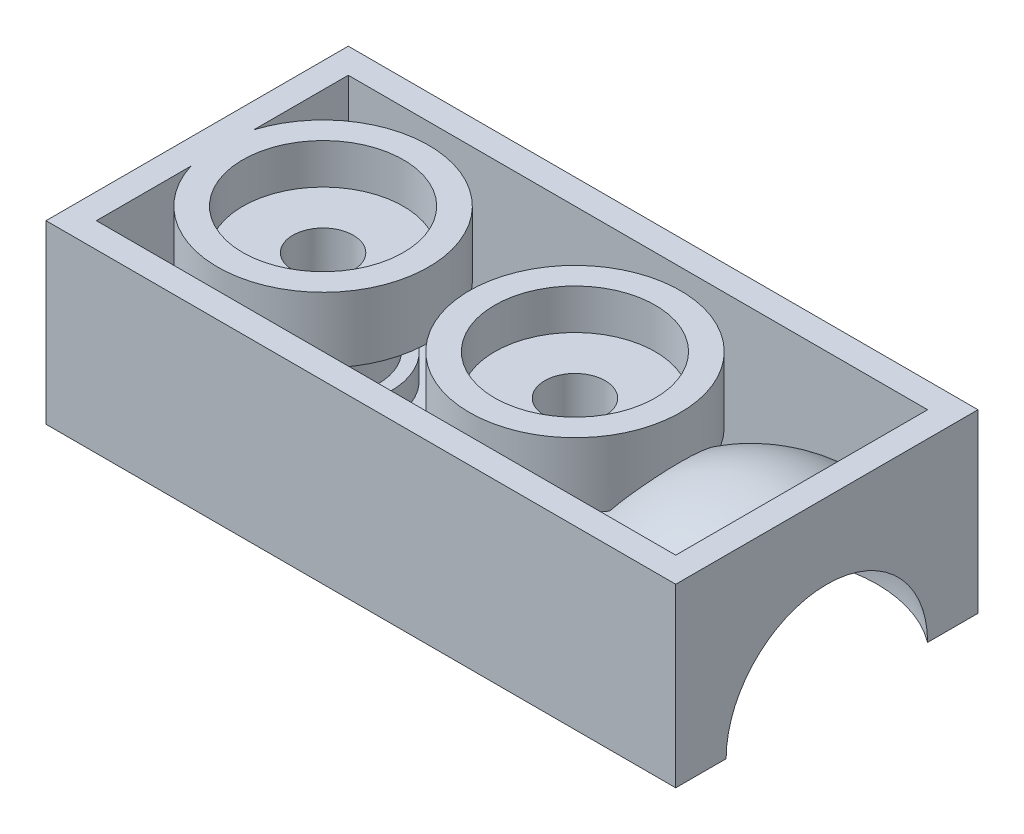
ISO-10303-21;
HEADER;
FILE_DESCRIPTION(('STEP AP214'),'2;1');
FILE_NAME('part.step','',(''),(''),'','','');
FILE_SCHEMA(('AUTOMOTIVE_DESIGN { 1 0 10303 214 1 1 1 1 }'));
ENDSEC;
DATA;
#1=APPLICATION_CONTEXT('core data for automotive mechanical design processes');
#2=APPLICATION_PROTOCOL_DEFINITION('international standard','automotive_design',2000,#1);
#3=PRODUCT_CONTEXT('',#1,'mechanical');
#4=PRODUCT('Part','Part','',(#3));
#5=PRODUCT_RELATED_PRODUCT_CATEGORY('part','',(#4));
#6=PRODUCT_DEFINITION_FORMATION('','',#4);
#7=PRODUCT_DEFINITION_CONTEXT('part definition',#1,'design');
#8=PRODUCT_DEFINITION('design','',#6,#7);
#9=PRODUCT_DEFINITION_SHAPE('','',#8);
#10=(LENGTH_UNIT() NAMED_UNIT(*) SI_UNIT(.MILLI.,.METRE.));
#11=(NAMED_UNIT(*) PLANE_ANGLE_UNIT() SI_UNIT($,.RADIAN.));
#12=(NAMED_UNIT(*) SI_UNIT($,.STERADIAN.) SOLID_ANGLE_UNIT());
#13=UNCERTAINTY_MEASURE_WITH_UNIT(LENGTH_MEASURE(1.E-05),#10,'distance_accuracy_value','');
#14=(GEOMETRIC_REPRESENTATION_CONTEXT(3) GLOBAL_UNCERTAINTY_ASSIGNED_CONTEXT((#13)) GLOBAL_UNIT_ASSIGNED_CONTEXT((#10,
#11,#12)) REPRESENTATION_CONTEXT('',''));
#15=CARTESIAN_POINT('',(0.,0.,0.));
#16=DIRECTION('',(0.,0.,1.));
#17=DIRECTION('',(1.,0.,0.));
#18=AXIS2_PLACEMENT_3D('',#15,#16,#17);
#19=CARTESIAN_POINT('',(0.,7.,0.));
#20=DIRECTION('',(0.,1.,0.));
#21=DIRECTION('',(0.,0.,1.));
#22=AXIS2_PLACEMENT_3D('',#19,#20,#21);
#23=PLANE('',#22);
#24=CARTESIAN_POINT('',(2.5,7.,0.));
#25=DIRECTION('',(0.,1.,0.));
#26=DIRECTION('',(0.,0.,1.));
#27=AXIS2_PLACEMENT_3D('',#24,#25,#26);
#28=CIRCLE('',#27,3.19);
#29=CARTESIAN_POINT('',(2.5,7.,3.19));
#30=VERTEX_POINT('',#29);
#31=EDGE_CURVE('E292',#30,#30,#28,.T.);
#32=ORIENTED_EDGE('',*,*,#31,.F.);
#33=EDGE_LOOP('',(#32));
#34=FACE_BOUND('',#33,.T.);
#35=CARTESIAN_POINT('',(2.5,7.,0.));
#36=DIRECTION('',(0.,1.,0.));
#37=DIRECTION('',(0.,0.,1.));
#38=AXIS2_PLACEMENT_3D('',#35,#36,#37);
#39=CIRCLE('',#38,4.19);
#40=CARTESIAN_POINT('',(2.5,7.,4.19));
#41=VERTEX_POINT('',#40);
#42=EDGE_CURVE('E180',#41,#41,#39,.T.);
#43=ORIENTED_EDGE('',*,*,#42,.T.);
#44=EDGE_LOOP('',(#43));
#45=FACE_BOUND('',#44,.T.);
#46=ADVANCED_FACE('F33',(#34,#45),#23,.T.);
#47=CARTESIAN_POINT('',(-7.5,7.,0.));
#48=DIRECTION('',(0.,1.,0.));
#49=DIRECTION('',(0.,0.,1.));
#50=AXIS2_PLACEMENT_3D('',#47,#48,#49);
#51=CYLINDRICAL_SURFACE('',#50,1.2);
#52=CARTESIAN_POINT('',(-7.5,5.4,0.));
#53=DIRECTION('',(0.,1.,0.));
#54=DIRECTION('',(0.,0.,1.));
#55=AXIS2_PLACEMENT_3D('',#52,#53,#54);
#56=CIRCLE('',#55,1.2);
#57=CARTESIAN_POINT('',(-7.5,5.4,1.2));
#58=VERTEX_POINT('',#57);
#59=EDGE_CURVE('E359',#58,#58,#56,.T.);
#60=ORIENTED_EDGE('',*,*,#59,.T.);
#61=EDGE_LOOP('',(#60));
#62=FACE_BOUND('',#61,.T.);
#63=CARTESIAN_POINT('',(-7.5,1.,0.));
#64=DIRECTION('',(0.,-1.,0.));
#65=DIRECTION('',(0.,0.,-1.));
#66=AXIS2_PLACEMENT_3D('',#63,#64,#65);
#67=CIRCLE('',#66,1.2);
#68=CARTESIAN_POINT('',(-7.5,1.,-1.2));
#69=VERTEX_POINT('',#68);
#70=EDGE_CURVE('E343',#69,#69,#67,.T.);
#71=ORIENTED_EDGE('',*,*,#70,.T.);
#72=EDGE_LOOP('',(#71));
#73=FACE_BOUND('',#72,.T.);
#74=ADVANCED_FACE('F247',(#62,#73),#51,.F.);
#75=CARTESIAN_POINT('',(-12.5,7.,-6.));
#76=DIRECTION('',(1.,0.,0.));
#77=DIRECTION('',(0.,0.,-1.));
#78=AXIS2_PLACEMENT_3D('',#75,#76,#77);
#79=PLANE('',#78);
#80=DIRECTION('',(0.,0.,1.));
#81=VECTOR('',#80,1.);
#82=CARTESIAN_POINT('',(-12.5,0.,-6.));
#83=LINE('',#82,#81);
#84=CARTESIAN_POINT('',(-12.5,0.,-6.));
#85=VERTEX_POINT('',#84);
#86=CARTESIAN_POINT('',(-12.5,0.,6.));
#87=VERTEX_POINT('',#86);
#88=EDGE_CURVE('E372',#85,#87,#83,.T.);
#89=ORIENTED_EDGE('',*,*,#88,.T.);
#90=DIRECTION('',(0.,-1.,0.));
#91=VECTOR('',#90,1.);
#92=CARTESIAN_POINT('',(-12.5,7.,6.));
#93=LINE('',#92,#91);
#94=CARTESIAN_POINT('',(-12.5,7.,6.));
#95=VERTEX_POINT('',#94);
#96=EDGE_CURVE('E41',#95,#87,#93,.T.);
#97=ORIENTED_EDGE('',*,*,#96,.F.);
#98=DIRECTION('',(0.,0.,1.));
#99=VECTOR('',#98,1.);
#100=CARTESIAN_POINT('',(-12.5,7.,-6.));
#101=LINE('',#100,#99);
#102=CARTESIAN_POINT('',(-12.5,7.,-6.));
#103=VERTEX_POINT('',#102);
#104=EDGE_CURVE('E373',#103,#95,#101,.T.);
#105=ORIENTED_EDGE('',*,*,#104,.F.);
#106=DIRECTION('',(0.,-1.,0.));
#107=VECTOR('',#106,1.);
#108=CARTESIAN_POINT('',(-12.5,7.,-6.));
#109=LINE('',#108,#107);
#110=EDGE_CURVE('E383',#103,#85,#109,.T.);
#111=ORIENTED_EDGE('',*,*,#110,.T.);
#112=EDGE_LOOP('',(#89,#97,#105,#111));
#113=FACE_BOUND('',#112,.T.);
#114=ADVANCED_FACE('F35',(#113),#79,.F.);
#115=CARTESIAN_POINT('',(-12.5,7.,6.));
#116=DIRECTION('',(0.,0.,-1.));
#117=DIRECTION('',(-1.,0.,0.));
#118=AXIS2_PLACEMENT_3D('',#115,#116,#117);
#119=PLANE('',#118);
#120=DIRECTION('',(1.,0.,0.));
#121=VECTOR('',#120,1.);
#122=CARTESIAN_POINT('',(-12.5,0.,6.));
#123=LINE('',#122,#121);
#124=CARTESIAN_POINT('',(12.5,0.,6.));
#125=VERTEX_POINT('',#124);
#126=EDGE_CURVE('E386',#87,#125,#123,.T.);
#127=ORIENTED_EDGE('',*,*,#126,.T.);
#128=DIRECTION('',(0.,-1.,0.));
#129=VECTOR('',#128,1.);
#130=CARTESIAN_POINT('',(12.5,7.,6.));
#131=LINE('',#130,#129);
#132=CARTESIAN_POINT('',(12.5,7.,6.));
#133=VERTEX_POINT('',#132);
#134=EDGE_CURVE('E398',#133,#125,#131,.T.);
#135=ORIENTED_EDGE('',*,*,#134,.F.);
#136=DIRECTION('',(1.,0.,0.));
#137=VECTOR('',#136,1.);
#138=CARTESIAN_POINT('',(-12.5,7.,6.));
#139=LINE('',#138,#137);
#140=EDGE_CURVE('E376',#95,#133,#139,.T.);
#141=ORIENTED_EDGE('',*,*,#140,.F.);
#142=ORIENTED_EDGE('',*,*,#96,.T.);
#143=EDGE_LOOP('',(#127,#135,#141,#142));
#144=FACE_BOUND('',#143,.T.);
#145=ADVANCED_FACE('F276',(#144),#119,.F.);
#146=CARTESIAN_POINT('',(12.5,7.,-6.));
#147=DIRECTION('',(-1.,0.,0.));
#148=DIRECTION('',(0.,0.,1.));
#149=AXIS2_PLACEMENT_3D('',#146,#147,#148);
#150=PLANE('',#149);
#151=CARTESIAN_POINT('',(12.5,0.,0.));
#152=DIRECTION('',(-1.,0.,0.));
#153=DIRECTION('',(0.,0.,1.));
#154=AXIS2_PLACEMENT_3D('',#151,#152,#153);
#155=CIRCLE('',#154,3.99924156033545);
#156=CARTESIAN_POINT('',(12.5,0.,-3.99924156033545));
#157=VERTEX_POINT('',#156);
#158=CARTESIAN_POINT('',(12.5,0.,3.99924156033545));
#159=VERTEX_POINT('',#158);
#160=EDGE_CURVE('E54',#157,#159,#155,.F.);
#161=ORIENTED_EDGE('',*,*,#160,.F.);
#162=DIRECTION('',(0.,0.,-1.));
#163=VECTOR('',#162,1.);
#164=CARTESIAN_POINT('',(12.5,0.,-6.));
#165=LINE('',#164,#163);
#166=CARTESIAN_POINT('',(12.5,0.,-6.));
#167=VERTEX_POINT('',#166);
#168=EDGE_CURVE('E388',#157,#167,#165,.T.);
#169=ORIENTED_EDGE('',*,*,#168,.T.);
#170=DIRECTION('',(0.,-1.,0.));
#171=VECTOR('',#170,1.);
#172=CARTESIAN_POINT('',(12.5,7.,-6.));
#173=LINE('',#172,#171);
#174=CARTESIAN_POINT('',(12.5,7.,-6.));
#175=VERTEX_POINT('',#174);
#176=EDGE_CURVE('E395',#175,#167,#173,.T.);
#177=ORIENTED_EDGE('',*,*,#176,.F.);
#178=DIRECTION('',(0.,0.,-1.));
#179=VECTOR('',#178,1.);
#180=CARTESIAN_POINT('',(12.5,7.,-6.));
#181=LINE('',#180,#179);
#182=EDGE_CURVE('E379',#133,#175,#181,.T.);
#183=ORIENTED_EDGE('',*,*,#182,.F.);
#184=ORIENTED_EDGE('',*,*,#134,.T.);
#185=EDGE_CURVE('E389',#125,#159,#165,.T.);
#186=ORIENTED_EDGE('',*,*,#185,.T.);
#187=EDGE_LOOP('',(#161,#169,#177,#183,#184,#186));
#188=FACE_BOUND('',#187,.T.);
#189=ADVANCED_FACE('F273',(#188),#150,.F.);
#190=CARTESIAN_POINT('',(-12.5,7.,-6.));
#191=DIRECTION('',(0.,0.,1.));
#192=DIRECTION('',(1.,0.,0.));
#193=AXIS2_PLACEMENT_3D('',#190,#191,#192);
#194=PLANE('',#193);
#195=DIRECTION('',(-1.,0.,0.));
#196=VECTOR('',#195,1.);
#197=CARTESIAN_POINT('',(-12.5,0.,-6.));
#198=LINE('',#197,#196);
#199=EDGE_CURVE('E377',#167,#85,#198,.T.);
#200=ORIENTED_EDGE('',*,*,#199,.T.);
#201=ORIENTED_EDGE('',*,*,#110,.F.);
#202=DIRECTION('',(-1.,0.,0.));
#203=VECTOR('',#202,1.);
#204=CARTESIAN_POINT('',(-12.5,7.,-6.));
#205=LINE('',#204,#203);
#206=EDGE_CURVE('E381',#175,#103,#205,.T.);
#207=ORIENTED_EDGE('',*,*,#206,.F.);
#208=ORIENTED_EDGE('',*,*,#176,.T.);
#209=EDGE_LOOP('',(#200,#201,#207,#208));
#210=FACE_BOUND('',#209,.T.);
#211=ADVANCED_FACE('F266',(#210),#194,.F.);
#212=DIRECTION('',(0.,0.,1.));
#213=VECTOR('',#212,1.);
#214=CARTESIAN_POINT('',(-11.5,7.,-6.));
#215=LINE('',#214,#213);
#216=CARTESIAN_POINT('',(-11.5,7.,-5.));
#217=VERTEX_POINT('',#216);
#218=CARTESIAN_POINT('',(-11.5,7.,-1.2474373731775));
#219=VERTEX_POINT('',#218);
#220=EDGE_CURVE('E186',#217,#219,#215,.T.);
#221=ORIENTED_EDGE('',*,*,#220,.F.);
#222=DIRECTION('',(-1.,0.,0.));
#223=VECTOR('',#222,1.);
#224=CARTESIAN_POINT('',(-12.5,7.,-5.));
#225=LINE('',#224,#223);
#226=CARTESIAN_POINT('',(11.5,7.,-5.));
#227=VERTEX_POINT('',#226);
#228=EDGE_CURVE('E168',#227,#217,#225,.T.);
#229=ORIENTED_EDGE('',*,*,#228,.F.);
#230=DIRECTION('',(0.,0.,-1.));
#231=VECTOR('',#230,1.);
#232=CARTESIAN_POINT('',(11.5,7.,-6.));
#233=LINE('',#232,#231);
#234=CARTESIAN_POINT('',(11.5,7.,5.));
#235=VERTEX_POINT('',#234);
#236=EDGE_CURVE('E48',#235,#227,#233,.T.);
#237=ORIENTED_EDGE('',*,*,#236,.F.);
#238=DIRECTION('',(1.,0.,0.));
#239=VECTOR('',#238,1.);
#240=CARTESIAN_POINT('',(-12.5,7.,5.));
#241=LINE('',#240,#239);
#242=CARTESIAN_POINT('',(-11.5,7.,5.));
#243=VERTEX_POINT('',#242);
#244=EDGE_CURVE('E189',#243,#235,#241,.T.);
#245=ORIENTED_EDGE('',*,*,#244,.F.);
#246=CARTESIAN_POINT('',(-11.5,7.,1.24743737317751));
#247=VERTEX_POINT('',#246);
#248=EDGE_CURVE('E148',#247,#243,#215,.T.);
#249=ORIENTED_EDGE('',*,*,#248,.F.);
#250=CARTESIAN_POINT('',(-7.5,7.,0.));
#251=DIRECTION('',(0.,1.,0.));
#252=DIRECTION('',(0.,0.,1.));
#253=AXIS2_PLACEMENT_3D('',#250,#251,#252);
#254=CIRCLE('',#253,4.19);
#255=EDGE_CURVE('E181',#247,#219,#254,.T.);
#256=ORIENTED_EDGE('',*,*,#255,.T.);
#257=EDGE_LOOP('',(#221,#229,#237,#245,#249,#256));
#258=FACE_BOUND('',#257,.T.);
#259=CARTESIAN_POINT('',(-7.5,7.,0.));
#260=DIRECTION('',(0.,1.,0.));
#261=DIRECTION('',(0.,0.,1.));
#262=AXIS2_PLACEMENT_3D('',#259,#260,#261);
#263=CIRCLE('',#262,3.19);
#264=CARTESIAN_POINT('',(-7.5,7.,3.19));
#265=VERTEX_POINT('',#264);
#266=EDGE_CURVE('E351',#265,#265,#263,.T.);
#267=ORIENTED_EDGE('',*,*,#266,.F.);
#268=EDGE_LOOP('',(#267));
#269=FACE_BOUND('',#268,.T.);
#270=ORIENTED_EDGE('',*,*,#104,.T.);
#271=ORIENTED_EDGE('',*,*,#140,.T.);
#272=ORIENTED_EDGE('',*,*,#182,.T.);
#273=ORIENTED_EDGE('',*,*,#206,.T.);
#274=EDGE_LOOP('',(#270,#271,#272,#273));
#275=FACE_BOUND('',#274,.T.);
#276=ADVANCED_FACE('F263',(#258,#269,#275),#23,.T.);
#277=CARTESIAN_POINT('',(0.,0.,0.));
#278=DIRECTION('',(0.,1.,0.));
#279=DIRECTION('',(0.,0.,1.));
#280=AXIS2_PLACEMENT_3D('',#277,#278,#279);
#281=PLANE('',#280);
#282=CARTESIAN_POINT('',(9.5,0.,0.));
#283=DIRECTION('',(0.,1.,0.));
#284=DIRECTION('',(0.,0.,1.));
#285=AXIS2_PLACEMENT_3D('',#282,#283,#284);
#286=CIRCLE('',#285,4.99939326897918);
#287=EDGE_CURVE('E11',#159,#157,#286,.F.);
#288=ORIENTED_EDGE('',*,*,#287,.F.);
#289=ORIENTED_EDGE('',*,*,#185,.F.);
#290=ORIENTED_EDGE('',*,*,#126,.F.);
#291=ORIENTED_EDGE('',*,*,#88,.F.);
#292=ORIENTED_EDGE('',*,*,#199,.F.);
#293=ORIENTED_EDGE('',*,*,#168,.F.);
#294=EDGE_LOOP('',(#288,#289,#290,#291,#292,#293));
#295=FACE_BOUND('',#294,.T.);
#296=CARTESIAN_POINT('',(-7.5,0.,0.));
#297=DIRECTION('',(0.,-1.,0.));
#298=DIRECTION('',(0.,0.,-1.));
#299=AXIS2_PLACEMENT_3D('',#296,#297,#298);
#300=CIRCLE('',#299,1.7);
#301=CARTESIAN_POINT('',(-7.5,0.,-1.7));
#302=VERTEX_POINT('',#301);
#303=EDGE_CURVE('E345',#302,#302,#300,.T.);
#304=ORIENTED_EDGE('',*,*,#303,.F.);
#305=EDGE_LOOP('',(#304));
#306=FACE_BOUND('',#305,.T.);
#307=CARTESIAN_POINT('',(2.5,0.,0.));
#308=DIRECTION('',(0.,1.,0.));
#309=DIRECTION('',(0.,0.,1.));
#310=AXIS2_PLACEMENT_3D('',#307,#308,#309);
#311=CIRCLE('',#310,1.2);
#312=CARTESIAN_POINT('',(2.5,0.,1.2));
#313=VERTEX_POINT('',#312);
#314=EDGE_CURVE('E369',#313,#313,#311,.T.);
#315=ORIENTED_EDGE('',*,*,#314,.T.);
#316=EDGE_LOOP('',(#315));
#317=FACE_BOUND('',#316,.T.);
#318=ADVANCED_FACE('F261',(#295,#306,#317),#281,.F.);
#319=CARTESIAN_POINT('',(2.5,7.,0.));
#320=DIRECTION('',(0.,1.,0.));
#321=DIRECTION('',(0.,0.,1.));
#322=AXIS2_PLACEMENT_3D('',#319,#320,#321);
#323=CYLINDRICAL_SURFACE('',#322,1.2);
#324=ORIENTED_EDGE('',*,*,#314,.F.);
#325=EDGE_LOOP('',(#324));
#326=FACE_BOUND('',#325,.T.);
#327=CARTESIAN_POINT('',(2.5,5.4,0.));
#328=DIRECTION('',(0.,1.,0.));
#329=DIRECTION('',(0.,0.,1.));
#330=AXIS2_PLACEMENT_3D('',#327,#328,#329);
#331=CIRCLE('',#330,1.2);
#332=CARTESIAN_POINT('',(2.5,5.4,1.2));
#333=VERTEX_POINT('',#332);
#334=EDGE_CURVE('E366',#333,#333,#331,.T.);
#335=ORIENTED_EDGE('',*,*,#334,.T.);
#336=EDGE_LOOP('',(#335));
#337=FACE_BOUND('',#336,.T.);
#338=ADVANCED_FACE('F257',(#326,#337),#323,.F.);
#339=CARTESIAN_POINT('',(3.7,5.4,0.));
#340=DIRECTION('',(0.,-1.,0.));
#341=DIRECTION('',(0.,0.,-1.));
#342=AXIS2_PLACEMENT_3D('',#339,#340,#341);
#343=PLANE('',#342);
#344=ORIENTED_EDGE('',*,*,#334,.F.);
#345=EDGE_LOOP('',(#344));
#346=FACE_BOUND('',#345,.T.);
#347=CARTESIAN_POINT('',(2.5,5.4,0.));
#348=DIRECTION('',(0.,1.,0.));
#349=DIRECTION('',(0.,0.,1.));
#350=AXIS2_PLACEMENT_3D('',#347,#348,#349);
#351=CIRCLE('',#350,3.19);
#352=CARTESIAN_POINT('',(2.5,5.4,3.19));
#353=VERTEX_POINT('',#352);
#354=EDGE_CURVE('E363',#353,#353,#351,.T.);
#355=ORIENTED_EDGE('',*,*,#354,.T.);
#356=EDGE_LOOP('',(#355));
#357=FACE_BOUND('',#356,.T.);
#358=ADVANCED_FACE('F253',(#346,#357),#343,.F.);
#359=CARTESIAN_POINT('',(2.5,7.,0.));
#360=DIRECTION('',(0.,1.,0.));
#361=DIRECTION('',(0.,0.,1.));
#362=AXIS2_PLACEMENT_3D('',#359,#360,#361);
#363=CYLINDRICAL_SURFACE('',#362,3.19);
#364=ORIENTED_EDGE('',*,*,#354,.F.);
#365=EDGE_LOOP('',(#364));
#366=FACE_BOUND('',#365,.T.);
#367=ORIENTED_EDGE('',*,*,#31,.T.);
#368=EDGE_LOOP('',(#367));
#369=FACE_BOUND('',#368,.T.);
#370=ADVANCED_FACE('F245',(#366,#369),#363,.F.);
#371=CARTESIAN_POINT('',(-6.3,5.4,0.));
#372=DIRECTION('',(0.,-1.,0.));
#373=DIRECTION('',(0.,0.,-1.));
#374=AXIS2_PLACEMENT_3D('',#371,#372,#373);
#375=PLANE('',#374);
#376=ORIENTED_EDGE('',*,*,#59,.F.);
#377=EDGE_LOOP('',(#376));
#378=FACE_BOUND('',#377,.T.);
#379=CARTESIAN_POINT('',(-7.5,5.4,0.));
#380=DIRECTION('',(0.,1.,0.));
#381=DIRECTION('',(0.,0.,1.));
#382=AXIS2_PLACEMENT_3D('',#379,#380,#381);
#383=CIRCLE('',#382,3.19);
#384=CARTESIAN_POINT('',(-7.5,5.4,3.19));
#385=VERTEX_POINT('',#384);
#386=EDGE_CURVE('E356',#385,#385,#383,.T.);
#387=ORIENTED_EDGE('',*,*,#386,.T.);
#388=EDGE_LOOP('',(#387));
#389=FACE_BOUND('',#388,.T.);
#390=ADVANCED_FACE('F241',(#378,#389),#375,.F.);
#391=CARTESIAN_POINT('',(-7.5,7.,0.));
#392=DIRECTION('',(0.,1.,0.));
#393=DIRECTION('',(0.,0.,1.));
#394=AXIS2_PLACEMENT_3D('',#391,#392,#393);
#395=CYLINDRICAL_SURFACE('',#394,3.19);
#396=ORIENTED_EDGE('',*,*,#386,.F.);
#397=EDGE_LOOP('',(#396));
#398=FACE_BOUND('',#397,.T.);
#399=ORIENTED_EDGE('',*,*,#266,.T.);
#400=EDGE_LOOP('',(#399));
#401=FACE_BOUND('',#400,.T.);
#402=ADVANCED_FACE('F237',(#398,#401),#395,.F.);
#403=CARTESIAN_POINT('',(-7.5,1.,0.));
#404=DIRECTION('',(0.,-1.,0.));
#405=DIRECTION('',(0.,0.,-1.));
#406=AXIS2_PLACEMENT_3D('',#403,#404,#405);
#407=CYLINDRICAL_SURFACE('',#406,1.7);
#408=CARTESIAN_POINT('',(-7.5,1.,0.));
#409=DIRECTION('',(0.,-1.,0.));
#410=DIRECTION('',(0.,0.,-1.));
#411=AXIS2_PLACEMENT_3D('',#408,#409,#410);
#412=CIRCLE('',#411,1.7);
#413=CARTESIAN_POINT('',(-7.5,1.,-1.7));
#414=VERTEX_POINT('',#413);
#415=EDGE_CURVE('E348',#414,#414,#412,.T.);
#416=ORIENTED_EDGE('',*,*,#415,.F.);
#417=EDGE_LOOP('',(#416));
#418=FACE_BOUND('',#417,.T.);
#419=ORIENTED_EDGE('',*,*,#303,.T.);
#420=EDGE_LOOP('',(#419));
#421=FACE_BOUND('',#420,.T.);
#422=ADVANCED_FACE('F233',(#418,#421),#407,.F.);
#423=CARTESIAN_POINT('',(-7.5,1.,0.));
#424=DIRECTION('',(0.,-1.,0.));
#425=DIRECTION('',(0.,0.,-1.));
#426=AXIS2_PLACEMENT_3D('',#423,#424,#425);
#427=PLANE('',#426);
#428=ORIENTED_EDGE('',*,*,#70,.F.);
#429=EDGE_LOOP('',(#428));
#430=FACE_BOUND('',#429,.T.);
#431=ORIENTED_EDGE('',*,*,#415,.T.);
#432=EDGE_LOOP('',(#431));
#433=FACE_BOUND('',#432,.T.);
#434=ADVANCED_FACE('F230',(#430,#433),#427,.T.);
#435=CARTESIAN_POINT('',(9.5,0.,0.));
#436=DIRECTION('',(-1.,0.,0.));
#437=DIRECTION('',(0.,0.,1.));
#438=AXIS2_PLACEMENT_3D('',#435,#436,#437);
#439=SPHERICAL_SURFACE('',#438,4.99939326897918);
#440=ORIENTED_EDGE('',*,*,#160,.T.);
#441=ORIENTED_EDGE('',*,*,#287,.T.);
#442=EDGE_LOOP('',(#440,#441));
#443=FACE_BOUND('',#442,.T.);
#444=ADVANCED_FACE('F226',(#443),#439,.F.);
#445=CARTESIAN_POINT('',(-7.5,7.,0.));
#446=DIRECTION('',(0.,1.,0.));
#447=DIRECTION('',(0.,0.,1.));
#448=AXIS2_PLACEMENT_3D('',#445,#446,#447);
#449=CYLINDRICAL_SURFACE('',#448,2.2);
#450=CARTESIAN_POINT('',(-7.5,4.4,0.));
#451=DIRECTION('',(0.,-1.,0.));
#452=DIRECTION('',(0.,0.,-1.));
#453=AXIS2_PLACEMENT_3D('',#450,#451,#452);
#454=CIRCLE('',#453,2.2);
#455=CARTESIAN_POINT('',(-7.5,4.4,-2.2));
#456=VERTEX_POINT('',#455);
#457=EDGE_CURVE('E195',#456,#456,#454,.F.);
#458=ORIENTED_EDGE('',*,*,#457,.F.);
#459=EDGE_LOOP('',(#458));
#460=FACE_BOUND('',#459,.T.);
#461=CARTESIAN_POINT('',(-7.5,2.,0.));
#462=DIRECTION('',(0.,-1.,0.));
#463=DIRECTION('',(0.,0.,-1.));
#464=AXIS2_PLACEMENT_3D('',#461,#462,#463);
#465=CIRCLE('',#464,2.2);
#466=CARTESIAN_POINT('',(-7.5,2.,-2.2));
#467=VERTEX_POINT('',#466);
#468=EDGE_CURVE('E173',#467,#467,#465,.T.);
#469=ORIENTED_EDGE('',*,*,#468,.F.);
#470=EDGE_LOOP('',(#469));
#471=FACE_BOUND('',#470,.T.);
#472=ADVANCED_FACE('F229',(#460,#471),#449,.T.);
#473=CARTESIAN_POINT('',(-11.5,7.,-6.));
#474=DIRECTION('',(1.,0.,0.));
#475=DIRECTION('',(0.,0.,-1.));
#476=AXIS2_PLACEMENT_3D('',#473,#474,#475);
#477=PLANE('',#476);
#478=DIRECTION('',(0.,1.,0.));
#479=VECTOR('',#478,1.);
#480=CARTESIAN_POINT('',(-11.5,7.,1.2474373731775));
#481=LINE('',#480,#479);
#482=CARTESIAN_POINT('',(-11.5,4.4,1.2474373731775));
#483=VERTEX_POINT('',#482);
#484=EDGE_CURVE('E196',#247,#483,#481,.F.);
#485=ORIENTED_EDGE('',*,*,#484,.F.);
#486=ORIENTED_EDGE('',*,*,#248,.T.);
#487=DIRECTION('',(0.,-1.,0.));
#488=VECTOR('',#487,1.);
#489=CARTESIAN_POINT('',(-11.5,7.,5.));
#490=LINE('',#489,#488);
#491=CARTESIAN_POINT('',(-11.5,1.,5.));
#492=VERTEX_POINT('',#491);
#493=EDGE_CURVE('E132',#243,#492,#490,.T.);
#494=ORIENTED_EDGE('',*,*,#493,.T.);
#495=DIRECTION('',(0.,0.,1.));
#496=VECTOR('',#495,1.);
#497=CARTESIAN_POINT('',(-11.5,1.,-6.));
#498=LINE('',#497,#496);
#499=CARTESIAN_POINT('',(-11.5,1.,-5.));
#500=VERTEX_POINT('',#499);
#501=EDGE_CURVE('E141',#500,#492,#498,.T.);
#502=ORIENTED_EDGE('',*,*,#501,.F.);
#503=DIRECTION('',(0.,-1.,0.));
#504=VECTOR('',#503,1.);
#505=CARTESIAN_POINT('',(-11.5,7.,-5.));
#506=LINE('',#505,#504);
#507=EDGE_CURVE('E165',#217,#500,#506,.T.);
#508=ORIENTED_EDGE('',*,*,#507,.F.);
#509=ORIENTED_EDGE('',*,*,#220,.T.);
#510=DIRECTION('',(0.,1.,0.));
#511=VECTOR('',#510,1.);
#512=CARTESIAN_POINT('',(-11.5,7.,-1.2474373731775));
#513=LINE('',#512,#511);
#514=CARTESIAN_POINT('',(-11.5,4.4,-1.2474373731775));
#515=VERTEX_POINT('',#514);
#516=EDGE_CURVE('E198',#219,#515,#513,.F.);
#517=ORIENTED_EDGE('',*,*,#516,.T.);
#518=DIRECTION('',(0.,0.,-1.));
#519=VECTOR('',#518,1.);
#520=CARTESIAN_POINT('',(-11.5,4.4,-6.));
#521=LINE('',#520,#519);
#522=EDGE_CURVE('E212',#483,#515,#521,.T.);
#523=ORIENTED_EDGE('',*,*,#522,.F.);
#524=EDGE_LOOP('',(#485,#486,#494,#502,#508,#509,#517,#523));
#525=FACE_BOUND('',#524,.T.);
#526=ADVANCED_FACE('F145',(#525),#477,.T.);
#527=CARTESIAN_POINT('',(-12.5,7.,5.));
#528=DIRECTION('',(0.,0.,-1.));
#529=DIRECTION('',(-1.,0.,0.));
#530=AXIS2_PLACEMENT_3D('',#527,#528,#529);
#531=PLANE('',#530);
#532=DIRECTION('',(1.,0.,0.));
#533=VECTOR('',#532,1.);
#534=CARTESIAN_POINT('',(-12.5,1.,5.));
#535=LINE('',#534,#533);
#536=CARTESIAN_POINT('',(6.3388736823922,1.,5.));
#537=VERTEX_POINT('',#536);
#538=EDGE_CURVE('E129',#492,#537,#535,.T.);
#539=ORIENTED_EDGE('',*,*,#538,.F.);
#540=ORIENTED_EDGE('',*,*,#493,.F.);
#541=ORIENTED_EDGE('',*,*,#244,.T.);
#542=DIRECTION('',(0.,-1.,0.));
#543=VECTOR('',#542,1.);
#544=CARTESIAN_POINT('',(11.5,7.,5.));
#545=LINE('',#544,#543);
#546=CARTESIAN_POINT('',(11.5,2.64437508607849,5.));
#547=VERTEX_POINT('',#546);
#548=EDGE_CURVE('E150',#235,#547,#545,.T.);
#549=ORIENTED_EDGE('',*,*,#548,.T.);
#550=CARTESIAN_POINT('',(9.5,0.,5.));
#551=DIRECTION('',(0.,0.,-1.));
#552=DIRECTION('',(-1.,0.,0.));
#553=AXIS2_PLACEMENT_3D('',#550,#551,#552);
#554=CIRCLE('',#553,3.31552704646979);
#555=EDGE_CURVE('E135',#537,#547,#554,.T.);
#556=ORIENTED_EDGE('',*,*,#555,.F.);
#557=EDGE_LOOP('',(#539,#540,#541,#549,#556));
#558=FACE_BOUND('',#557,.T.);
#559=ADVANCED_FACE('F131',(#558),#531,.T.);
#560=CARTESIAN_POINT('',(11.5,7.,-6.));
#561=DIRECTION('',(-1.,0.,0.));
#562=DIRECTION('',(0.,0.,1.));
#563=AXIS2_PLACEMENT_3D('',#560,#561,#562);
#564=PLANE('',#563);
#565=ORIENTED_EDGE('',*,*,#548,.F.);
#566=ORIENTED_EDGE('',*,*,#236,.T.);
#567=DIRECTION('',(0.,-1.,0.));
#568=VECTOR('',#567,1.);
#569=CARTESIAN_POINT('',(11.5,7.,-5.));
#570=LINE('',#569,#568);
#571=CARTESIAN_POINT('',(11.5,2.6443750860785,-5.));
#572=VERTEX_POINT('',#571);
#573=EDGE_CURVE('E167',#227,#572,#570,.T.);
#574=ORIENTED_EDGE('',*,*,#573,.T.);
#575=CARTESIAN_POINT('',(11.5,0.,0.));
#576=DIRECTION('',(-1.,0.,0.));
#577=DIRECTION('',(0.,0.,1.));
#578=AXIS2_PLACEMENT_3D('',#575,#576,#577);
#579=CIRCLE('',#578,5.65621070999593);
#580=EDGE_CURVE('E170',#572,#547,#579,.F.);
#581=ORIENTED_EDGE('',*,*,#580,.T.);
#582=EDGE_LOOP('',(#565,#566,#574,#581));
#583=FACE_BOUND('',#582,.T.);
#584=ADVANCED_FACE('F448',(#583),#564,.T.);
#585=CARTESIAN_POINT('',(-12.5,7.,-5.));
#586=DIRECTION('',(0.,0.,1.));
#587=DIRECTION('',(1.,0.,0.));
#588=AXIS2_PLACEMENT_3D('',#585,#586,#587);
#589=PLANE('',#588);
#590=CARTESIAN_POINT('',(9.5,0.,-5.));
#591=DIRECTION('',(0.,0.,1.));
#592=DIRECTION('',(1.,0.,0.));
#593=AXIS2_PLACEMENT_3D('',#590,#591,#592);
#594=CIRCLE('',#593,3.31552704646979);
#595=CARTESIAN_POINT('',(6.33887368239219,1.,-5.));
#596=VERTEX_POINT('',#595);
#597=EDGE_CURVE('E201',#596,#572,#594,.F.);
#598=ORIENTED_EDGE('',*,*,#597,.T.);
#599=ORIENTED_EDGE('',*,*,#573,.F.);
#600=ORIENTED_EDGE('',*,*,#228,.T.);
#601=ORIENTED_EDGE('',*,*,#507,.T.);
#602=DIRECTION('',(-1.,0.,0.));
#603=VECTOR('',#602,1.);
#604=CARTESIAN_POINT('',(-12.5,1.,-5.));
#605=LINE('',#604,#603);
#606=EDGE_CURVE('E140',#596,#500,#605,.T.);
#607=ORIENTED_EDGE('',*,*,#606,.F.);
#608=EDGE_LOOP('',(#598,#599,#600,#601,#607));
#609=FACE_BOUND('',#608,.T.);
#610=ADVANCED_FACE('F333',(#609),#589,.T.);
#611=CARTESIAN_POINT('',(0.,1.,0.));
#612=DIRECTION('',(0.,1.,0.));
#613=DIRECTION('',(0.,0.,1.));
#614=AXIS2_PLACEMENT_3D('',#611,#612,#613);
#615=PLANE('',#614);
#616=ORIENTED_EDGE('',*,*,#606,.T.);
#617=ORIENTED_EDGE('',*,*,#501,.T.);
#618=ORIENTED_EDGE('',*,*,#538,.T.);
#619=CARTESIAN_POINT('',(9.5,1.,0.));
#620=DIRECTION('',(0.,1.,0.));
#621=DIRECTION('',(0.,0.,1.));
#622=AXIS2_PLACEMENT_3D('',#619,#620,#621);
#623=CIRCLE('',#622,5.91546444464614);
#624=CARTESIAN_POINT('',(3.84623431458052,1.,1.74001527873921));
#625=VERTEX_POINT('',#624);
#626=EDGE_CURVE('E149',#537,#625,#623,.F.);
#627=ORIENTED_EDGE('',*,*,#626,.T.);
#628=CARTESIAN_POINT('',(2.5,1.,0.));
#629=DIRECTION('',(0.,1.,0.));
#630=DIRECTION('',(0.,0.,1.));
#631=AXIS2_PLACEMENT_3D('',#628,#629,#630);
#632=CIRCLE('',#631,2.2);
#633=CARTESIAN_POINT('',(3.84623431458052,1.,-1.74001527873921));
#634=VERTEX_POINT('',#633);
#635=EDGE_CURVE('E157',#634,#625,#632,.T.);
#636=ORIENTED_EDGE('',*,*,#635,.F.);
#637=EDGE_CURVE('E199',#634,#596,#623,.F.);
#638=ORIENTED_EDGE('',*,*,#637,.T.);
#639=EDGE_LOOP('',(#616,#617,#618,#627,#636,#638));
#640=FACE_BOUND('',#639,.T.);
#641=CARTESIAN_POINT('',(-7.5,1.,0.));
#642=DIRECTION('',(0.,1.,0.));
#643=DIRECTION('',(0.,0.,1.));
#644=AXIS2_PLACEMENT_3D('',#641,#642,#643);
#645=CIRCLE('',#644,2.7);
#646=CARTESIAN_POINT('',(-7.5,1.,2.7));
#647=VERTEX_POINT('',#646);
#648=EDGE_CURVE('E324',#647,#647,#645,.F.);
#649=ORIENTED_EDGE('',*,*,#648,.T.);
#650=EDGE_LOOP('',(#649));
#651=FACE_BOUND('',#650,.T.);
#652=ADVANCED_FACE('F152',(#640,#651),#615,.T.);
#653=CARTESIAN_POINT('',(2.5,7.,0.));
#654=DIRECTION('',(0.,1.,0.));
#655=DIRECTION('',(0.,0.,1.));
#656=AXIS2_PLACEMENT_3D('',#653,#654,#655);
#657=CYLINDRICAL_SURFACE('',#656,2.2);
#658=ORIENTED_EDGE('',*,*,#635,.T.);
#659=CARTESIAN_POINT('',(3.83150314434135,-0.890934125876624,1.75131361457881));
#660=CARTESIAN_POINT('',(3.82163535949646,-0.813428942234278,1.75880599388677));
#661=CARTESIAN_POINT('',(3.8130279130597,-0.735662643119251,1.765228418507));
#662=CARTESIAN_POINT('',(3.79838038125389,-0.579750081731128,1.77603501708953));
#663=CARTESIAN_POINT('',(3.79234020457428,-0.501603833071777,1.78041926354462));
#664=CARTESIAN_POINT('',(3.78287121912137,-0.345035552747033,1.78725310393925));
#665=CARTESIAN_POINT('',(3.77944349754233,-0.266613419894094,1.78970189243803));
#666=CARTESIAN_POINT('',(3.77522464949003,-0.10966639924751,1.79270939865667));
#667=CARTESIAN_POINT('',(3.77443355611886,-0.0311415101761727,1.79326809264696));
#668=CARTESIAN_POINT('',(3.77604877656092,0.20702060780681,1.79212715694362));
#669=CARTESIAN_POINT('',(3.78260261781987,0.366646471139234,1.78749819276666));
#670=CARTESIAN_POINT('',(3.80647706086309,0.684595358805672,1.7701227002061));
#671=CARTESIAN_POINT('',(3.82379473526257,0.84291872551483,1.75737837889169));
#672=CARTESIAN_POINT('',(3.86583117500034,1.13718170768875,1.72485179259172));
#673=CARTESIAN_POINT('',(3.8893344208296,1.27341609382073,1.70616564631101));
#674=CARTESIAN_POINT('',(3.94359301530917,1.54311485547229,1.66051256050592));
#675=CARTESIAN_POINT('',(3.97435138648181,1.67657805121802,1.6335421683032));
#676=CARTESIAN_POINT('',(4.04197106972792,1.93837814472473,1.56986210569255));
#677=CARTESIAN_POINT('',(4.07878014540867,2.06674815917737,1.53323430205494));
#678=CARTESIAN_POINT('',(4.15739041841527,2.31773063612917,1.44790642642772));
#679=CARTESIAN_POINT('',(4.19918429397854,2.44035118330113,1.39922395007856));
#680=CARTESIAN_POINT('',(4.2739617903093,2.64492216379132,1.30219123990991));
#681=CARTESIAN_POINT('',(4.30622401452681,2.72881469608737,1.25740053681909));
#682=CARTESIAN_POINT('',(4.37128177539013,2.89088640558646,1.1583708061128));
#683=CARTESIAN_POINT('',(4.40407794538945,2.96905808523231,1.10411968401726));
#684=CARTESIAN_POINT('',(4.46886734718138,3.11808797579311,0.984012396660958));
#685=CARTESIAN_POINT('',(4.50084742990435,3.1888542212461,0.918032775158923));
#686=CARTESIAN_POINT('',(4.56098891378517,3.31824160610655,0.773559902345116));
#687=CARTESIAN_POINT('',(4.58916208686488,3.37690049577453,0.695106939583717));
#688=CARTESIAN_POINT('',(4.62894498652554,3.45817108036751,0.557353574341296));
#689=CARTESIAN_POINT('',(4.64281252641457,3.48606610596273,0.501830063923828));
#690=CARTESIAN_POINT('',(4.66658263042147,3.53347396291717,0.386490486682272));
#691=CARTESIAN_POINT('',(4.67648864902017,3.5529940983399,0.326678213614787));
#692=CARTESIAN_POINT('',(4.69144085024657,3.58233381871621,0.203597184554412));
#693=CARTESIAN_POINT('',(4.69644979802221,3.59207909487056,0.140305752563779));
#694=CARTESIAN_POINT('',(4.70088586922954,3.60071431686519,0.0127923698192201));
#695=CARTESIAN_POINT('',(4.70031529304873,3.59960873641525,-0.0514291865487639));
#696=CARTESIAN_POINT('',(4.69401610927162,3.58733495523113,-0.171935046148705));
#697=CARTESIAN_POINT('',(4.68882147693652,3.57720838889933,-0.228358900126492));
#698=CARTESIAN_POINT('',(4.67449045862754,3.54905378586066,-0.338658698750061));
#699=CARTESIAN_POINT('',(4.66535237529436,3.53102234664693,-0.392533535142499));
#700=CARTESIAN_POINT('',(4.64036960936269,3.48119115674999,-0.513585688631966));
#701=CARTESIAN_POINT('',(4.6233125988396,3.44682685663645,-0.579453227104007));
#702=CARTESIAN_POINT('',(4.58530187828796,3.36874969718727,-0.70412157098292));
#703=CARTESIAN_POINT('',(4.56434082486127,3.32501919664958,-0.76290870943804));
#704=CARTESIAN_POINT('',(4.50935986781253,3.20759096031205,-0.900161513915995));
#705=CARTESIAN_POINT('',(4.47392857774566,3.12963123940906,-0.974386297038444));
#706=CARTESIAN_POINT('',(4.40154231962798,2.96332072647429,-1.1090544602488));
#707=CARTESIAN_POINT('',(4.36458440301396,2.87494915083854,-1.1694695428477));
#708=CARTESIAN_POINT('',(4.29725387714494,2.70560231192719,-1.27000869093236));
#709=CARTESIAN_POINT('',(4.26676242289938,2.62566057157061,-1.31183030064617));
#710=CARTESIAN_POINT('',(4.20725000651419,2.46189546524315,-1.38839888316505));
#711=CARTESIAN_POINT('',(4.17823005147323,2.37806951404115,-1.42314105859245));
#712=CARTESIAN_POINT('',(4.12222941994082,2.20709610327253,-1.48666431254954));
#713=CARTESIAN_POINT('',(4.09525821350048,2.11993572477414,-1.51541866610816));
#714=CARTESIAN_POINT('',(4.04399347194817,1.9433050479061,-1.56761536818965));
#715=CARTESIAN_POINT('',(4.01969955249322,1.85383508337544,-1.59105847968938));
#716=CARTESIAN_POINT('',(3.96131512305434,1.62206278850572,-1.64527773018846));
#717=CARTESIAN_POINT('',(3.9294257759768,1.47841933098576,-1.67273401140209));
#718=CARTESIAN_POINT('',(3.8741086456788,1.18800941203589,-1.71845969155871));
#719=CARTESIAN_POINT('',(3.85068753035358,1.04124058555058,-1.73672185546392));
#720=CARTESIAN_POINT('',(3.81325812284032,0.747994434984169,-1.76519099811762));
#721=CARTESIAN_POINT('',(3.79911333075766,0.601546034554787,-1.77551519323913));
#722=CARTESIAN_POINT('',(3.78480723934801,0.381327473073129,-1.78586098025672));
#723=CARTESIAN_POINT('',(3.78119049976422,0.307877183897401,-1.78845280711678));
#724=CARTESIAN_POINT('',(3.77626801833048,0.160862506216286,-1.79196699072684));
#725=CARTESIAN_POINT('',(3.77496217362904,0.0872981229347755,-1.79288942177704));
#726=CARTESIAN_POINT('',(3.77481919390904,0.013722630915652,-1.79299638115672));
#727=B_SPLINE_CURVE_WITH_KNOTS('',3,(#659,#660,#661,#662,#663,#664,#665,#666,#667,#668,#669,
#670,#671,#672,#673,#674,#675,#676,#677,#678,#679,#680,#681,#682,#683,#684,#685,#686,#687,#688,
#689,#690,#691,#692,#693,#694,#695,#696,#697,#698,#699,#700,#701,#702,#703,#704,#705,#706,#707,
#708,#709,#710,#711,#712,#713,#714,#715,#716,#717,#718,#719,#720,#721,#722,#723,#724,#725,#726),
.UNSPECIFIED.,.F.,.F.,(4,2,2,2,2,2,2,2,2,2,2,2,2,2,2,2,2,2,2,2,2,2,2,2,2,2,2,2,2,2,2,2,2,4),(0.,
0.235445586454603,0.470882798071848,0.70641793536497,0.941956029721414,1.42082636510471,
1.89956652151672,2.3176583176969,2.73592460165833,3.15075324787077,3.56497992107664,
3.86577643501728,4.16696035370443,4.47152579568966,4.77512677038528,4.96544052849952,
5.15558796759705,5.34717020082024,5.53867344974522,5.71057366683222,5.88254794795866,
6.10995592978367,6.33779606065291,6.67587439240476,7.01463939209895,7.29994505087096,
7.58544340869911,7.87218991887167,8.15889521083869,8.60728016154052,9.05601740610881,
9.49799384506458,9.71870147910353,9.93939928981345),.UNSPECIFIED.);
#728=EDGE_CURVE('E204',#634,#625,#727,.F.);
#729=ORIENTED_EDGE('',*,*,#728,.F.);
#730=EDGE_LOOP('',(#658,#729));
#731=FACE_BOUND('',#730,.T.);
#732=CARTESIAN_POINT('',(2.5,4.4,0.));
#733=DIRECTION('',(0.,-1.,0.));
#734=DIRECTION('',(0.,0.,-1.));
#735=AXIS2_PLACEMENT_3D('',#732,#733,#734);
#736=CIRCLE('',#735,2.2);
#737=CARTESIAN_POINT('',(2.5,4.4,-2.2));
#738=VERTEX_POINT('',#737);
#739=EDGE_CURVE('E160',#738,#738,#736,.F.);
#740=ORIENTED_EDGE('',*,*,#739,.F.);
#741=EDGE_LOOP('',(#740));
#742=FACE_BOUND('',#741,.T.);
#743=ADVANCED_FACE('F214',(#731,#742),#657,.T.);
#744=CARTESIAN_POINT('',(3.7,4.4,0.));
#745=DIRECTION('',(0.,-1.,0.));
#746=DIRECTION('',(0.,0.,-1.));
#747=AXIS2_PLACEMENT_3D('',#744,#745,#746);
#748=PLANE('',#747);
#749=ORIENTED_EDGE('',*,*,#739,.T.);
#750=EDGE_LOOP('',(#749));
#751=FACE_BOUND('',#750,.T.);
#752=CARTESIAN_POINT('',(2.5,4.4,0.));
#753=DIRECTION('',(0.,-1.,0.));
#754=DIRECTION('',(0.,0.,-1.));
#755=AXIS2_PLACEMENT_3D('',#752,#753,#754);
#756=CIRCLE('',#755,4.19);
#757=CARTESIAN_POINT('',(2.5,4.4,-4.19));
#758=VERTEX_POINT('',#757);
#759=EDGE_CURVE('E177',#758,#758,#756,.F.);
#760=ORIENTED_EDGE('',*,*,#759,.F.);
#761=EDGE_LOOP('',(#760));
#762=FACE_BOUND('',#761,.T.);
#763=ADVANCED_FACE('F298',(#751,#762),#748,.T.);
#764=CARTESIAN_POINT('',(2.5,7.,0.));
#765=DIRECTION('',(0.,1.,0.));
#766=DIRECTION('',(0.,0.,1.));
#767=AXIS2_PLACEMENT_3D('',#764,#765,#766);
#768=CYLINDRICAL_SURFACE('',#767,4.19);
#769=ORIENTED_EDGE('',*,*,#759,.T.);
#770=EDGE_LOOP('',(#769));
#771=FACE_BOUND('',#770,.T.);
#772=ORIENTED_EDGE('',*,*,#42,.F.);
#773=EDGE_LOOP('',(#772));
#774=FACE_BOUND('',#773,.T.);
#775=ADVANCED_FACE('F295',(#771,#774),#768,.T.);
#776=CARTESIAN_POINT('',(-6.3,4.4,0.));
#777=DIRECTION('',(0.,-1.,0.));
#778=DIRECTION('',(0.,0.,-1.));
#779=AXIS2_PLACEMENT_3D('',#776,#777,#778);
#780=PLANE('',#779);
#781=ORIENTED_EDGE('',*,*,#522,.T.);
#782=CARTESIAN_POINT('',(-7.5,4.4,0.));
#783=DIRECTION('',(0.,-1.,0.));
#784=DIRECTION('',(0.,0.,-1.));
#785=AXIS2_PLACEMENT_3D('',#782,#783,#784);
#786=CIRCLE('',#785,4.19);
#787=EDGE_CURVE('E184',#483,#515,#786,.F.);
#788=ORIENTED_EDGE('',*,*,#787,.F.);
#789=EDGE_LOOP('',(#781,#788));
#790=FACE_BOUND('',#789,.T.);
#791=ORIENTED_EDGE('',*,*,#457,.T.);
#792=EDGE_LOOP('',(#791));
#793=FACE_BOUND('',#792,.T.);
#794=ADVANCED_FACE('F297',(#790,#793),#780,.T.);
#795=CARTESIAN_POINT('',(-7.5,7.,0.));
#796=DIRECTION('',(0.,1.,0.));
#797=DIRECTION('',(0.,0.,1.));
#798=AXIS2_PLACEMENT_3D('',#795,#796,#797);
#799=CYLINDRICAL_SURFACE('',#798,4.19);
#800=ORIENTED_EDGE('',*,*,#255,.F.);
#801=ORIENTED_EDGE('',*,*,#484,.T.);
#802=ORIENTED_EDGE('',*,*,#787,.T.);
#803=ORIENTED_EDGE('',*,*,#516,.F.);
#804=EDGE_LOOP('',(#800,#801,#802,#803));
#805=FACE_BOUND('',#804,.T.);
#806=ADVANCED_FACE('F305',(#805),#799,.T.);
#807=CARTESIAN_POINT('',(-7.5,1.,0.));
#808=DIRECTION('',(0.,-1.,0.));
#809=DIRECTION('',(0.,0.,-1.));
#810=AXIS2_PLACEMENT_3D('',#807,#808,#809);
#811=CYLINDRICAL_SURFACE('',#810,2.7);
#812=CARTESIAN_POINT('',(-7.5,2.,0.));
#813=DIRECTION('',(0.,-1.,0.));
#814=DIRECTION('',(0.,0.,-1.));
#815=AXIS2_PLACEMENT_3D('',#812,#813,#814);
#816=CIRCLE('',#815,2.7);
#817=CARTESIAN_POINT('',(-7.5,2.,-2.7));
#818=VERTEX_POINT('',#817);
#819=EDGE_CURVE('E185',#818,#818,#816,.T.);
#820=ORIENTED_EDGE('',*,*,#819,.T.);
#821=EDGE_LOOP('',(#820));
#822=FACE_BOUND('',#821,.T.);
#823=ORIENTED_EDGE('',*,*,#648,.F.);
#824=EDGE_LOOP('',(#823));
#825=FACE_BOUND('',#824,.T.);
#826=ADVANCED_FACE('F311',(#822,#825),#811,.T.);
#827=CARTESIAN_POINT('',(-7.5,2.,0.));
#828=DIRECTION('',(0.,-1.,0.));
#829=DIRECTION('',(0.,0.,-1.));
#830=AXIS2_PLACEMENT_3D('',#827,#828,#829);
#831=PLANE('',#830);
#832=ORIENTED_EDGE('',*,*,#468,.T.);
#833=EDGE_LOOP('',(#832));
#834=FACE_BOUND('',#833,.T.);
#835=ORIENTED_EDGE('',*,*,#819,.F.);
#836=EDGE_LOOP('',(#835));
#837=FACE_BOUND('',#836,.T.);
#838=ADVANCED_FACE('F223',(#834,#837),#831,.F.);
#839=CARTESIAN_POINT('',(9.5,0.,0.));
#840=DIRECTION('',(-1.,0.,0.));
#841=DIRECTION('',(0.,0.,1.));
#842=AXIS2_PLACEMENT_3D('',#839,#840,#841);
#843=SPHERICAL_SURFACE('',#842,5.99939326897918);
#844=ORIENTED_EDGE('',*,*,#728,.T.);
#845=ORIENTED_EDGE('',*,*,#626,.F.);
#846=ORIENTED_EDGE('',*,*,#555,.T.);
#847=ORIENTED_EDGE('',*,*,#580,.F.);
#848=ORIENTED_EDGE('',*,*,#597,.F.);
#849=ORIENTED_EDGE('',*,*,#637,.F.);
#850=EDGE_LOOP('',(#844,#845,#846,#847,#848,#849));
#851=FACE_BOUND('',#850,.T.);
#852=ADVANCED_FACE('F218',(#851),#843,.T.);
#853=CLOSED_SHELL('',(#46,#74,#114,#145,#189,#211,#276,#318,#338,#358,#370,#390,#402,#422,#434,
#444,#472,#526,#559,#584,#610,#652,#743,#763,#775,#794,#806,#826,#838,#852));
#854=MANIFOLD_SOLID_BREP('B2',#853);
#855=ADVANCED_BREP_SHAPE_REPRESENTATION('',(#18,#854),#14);
#856=SHAPE_DEFINITION_REPRESENTATION(#9,#855);
ENDSEC;
END-ISO-10303-21;
